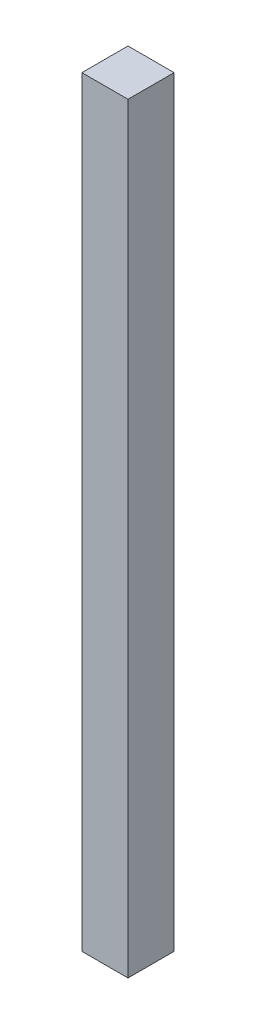
ISO-10303-21;
HEADER;
FILE_DESCRIPTION(('STEP AP214'),'2;1');
FILE_NAME('part.step','',(''),(''),'','','');
FILE_SCHEMA(('AUTOMOTIVE_DESIGN { 1 0 10303 214 1 1 1 1 }'));
ENDSEC;
DATA;
#1=APPLICATION_CONTEXT('core data for automotive mechanical design processes');
#2=APPLICATION_PROTOCOL_DEFINITION('international standard','automotive_design',2000,#1);
#3=PRODUCT_CONTEXT('',#1,'mechanical');
#4=PRODUCT('Part','Part','',(#3));
#5=PRODUCT_RELATED_PRODUCT_CATEGORY('part','',(#4));
#6=PRODUCT_DEFINITION_FORMATION('','',#4);
#7=PRODUCT_DEFINITION_CONTEXT('part definition',#1,'design');
#8=PRODUCT_DEFINITION('design','',#6,#7);
#9=PRODUCT_DEFINITION_SHAPE('','',#8);
#10=(LENGTH_UNIT() NAMED_UNIT(*) SI_UNIT(.MILLI.,.METRE.));
#11=(NAMED_UNIT(*) PLANE_ANGLE_UNIT() SI_UNIT($,.RADIAN.));
#12=(NAMED_UNIT(*) SI_UNIT($,.STERADIAN.) SOLID_ANGLE_UNIT());
#13=UNCERTAINTY_MEASURE_WITH_UNIT(LENGTH_MEASURE(1.E-05),#10,'distance_accuracy_value','');
#14=(GEOMETRIC_REPRESENTATION_CONTEXT(3) GLOBAL_UNCERTAINTY_ASSIGNED_CONTEXT((#13)) GLOBAL_UNIT_ASSIGNED_CONTEXT((#10,
#11,#12)) REPRESENTATION_CONTEXT('',''));
#15=CARTESIAN_POINT('',(0.,0.,0.));
#16=DIRECTION('',(0.,0.,1.));
#17=DIRECTION('',(1.,0.,0.));
#18=AXIS2_PLACEMENT_3D('',#15,#16,#17);
#19=CARTESIAN_POINT('',(10.,330.,-10.));
#20=DIRECTION('',(-1.,0.,0.));
#21=DIRECTION('',(0.,0.,1.));
#22=AXIS2_PLACEMENT_3D('',#19,#20,#21);
#23=PLANE('',#22);
#24=DIRECTION('',(0.,0.,-1.));
#25=VECTOR('',#24,1.);
#26=CARTESIAN_POINT('',(10.,0.,-10.));
#27=LINE('',#26,#25);
#28=CARTESIAN_POINT('',(10.,0.,9.99999999999999));
#29=VERTEX_POINT('',#28);
#30=CARTESIAN_POINT('',(10.,0.,-10.));
#31=VERTEX_POINT('',#30);
#32=EDGE_CURVE('E96',#29,#31,#27,.T.);
#33=ORIENTED_EDGE('',*,*,#32,.T.);
#34=DIRECTION('',(0.,-1.,0.));
#35=VECTOR('',#34,1.);
#36=CARTESIAN_POINT('',(10.,330.,-10.));
#37=LINE('',#36,#35);
#38=CARTESIAN_POINT('',(10.,330.,-10.));
#39=VERTEX_POINT('',#38);
#40=EDGE_CURVE('E11',#39,#31,#37,.T.);
#41=ORIENTED_EDGE('',*,*,#40,.F.);
#42=DIRECTION('',(0.,0.,-1.));
#43=VECTOR('',#42,1.);
#44=CARTESIAN_POINT('',(10.,330.,-10.));
#45=LINE('',#44,#43);
#46=CARTESIAN_POINT('',(10.,330.,9.99999999999999));
#47=VERTEX_POINT('',#46);
#48=EDGE_CURVE('E84',#47,#39,#45,.T.);
#49=ORIENTED_EDGE('',*,*,#48,.F.);
#50=DIRECTION('',(0.,-1.,0.));
#51=VECTOR('',#50,1.);
#52=CARTESIAN_POINT('',(10.,330.,9.99999999999999));
#53=LINE('',#52,#51);
#54=EDGE_CURVE('E92',#47,#29,#53,.T.);
#55=ORIENTED_EDGE('',*,*,#54,.T.);
#56=EDGE_LOOP('',(#33,#41,#49,#55));
#57=FACE_BOUND('',#56,.T.);
#58=ADVANCED_FACE('F33',(#57),#23,.F.);
#59=CARTESIAN_POINT('',(-10.,330.,-10.));
#60=DIRECTION('',(0.,0.,1.));
#61=DIRECTION('',(1.,0.,0.));
#62=AXIS2_PLACEMENT_3D('',#59,#60,#61);
#63=PLANE('',#62);
#64=DIRECTION('',(-1.,0.,0.));
#65=VECTOR('',#64,1.);
#66=CARTESIAN_POINT('',(-10.,0.,-10.));
#67=LINE('',#66,#65);
#68=CARTESIAN_POINT('',(-10.,0.,-10.));
#69=VERTEX_POINT('',#68);
#70=EDGE_CURVE('E88',#31,#69,#67,.T.);
#71=ORIENTED_EDGE('',*,*,#70,.T.);
#72=DIRECTION('',(0.,-1.,0.));
#73=VECTOR('',#72,1.);
#74=CARTESIAN_POINT('',(-10.,330.,-10.));
#75=LINE('',#74,#73);
#76=CARTESIAN_POINT('',(-10.,330.,-10.));
#77=VERTEX_POINT('',#76);
#78=EDGE_CURVE('E41',#77,#69,#75,.T.);
#79=ORIENTED_EDGE('',*,*,#78,.F.);
#80=DIRECTION('',(-1.,0.,0.));
#81=VECTOR('',#80,1.);
#82=CARTESIAN_POINT('',(-10.,330.,-10.));
#83=LINE('',#82,#81);
#84=EDGE_CURVE('E79',#39,#77,#83,.T.);
#85=ORIENTED_EDGE('',*,*,#84,.F.);
#86=ORIENTED_EDGE('',*,*,#40,.T.);
#87=EDGE_LOOP('',(#71,#79,#85,#86));
#88=FACE_BOUND('',#87,.T.);
#89=ADVANCED_FACE('F87',(#88),#63,.F.);
#90=CARTESIAN_POINT('',(-10.,330.,-10.));
#91=DIRECTION('',(1.,0.,0.));
#92=DIRECTION('',(0.,0.,-1.));
#93=AXIS2_PLACEMENT_3D('',#90,#91,#92);
#94=PLANE('',#93);
#95=DIRECTION('',(0.,0.,1.));
#96=VECTOR('',#95,1.);
#97=CARTESIAN_POINT('',(-10.,0.,-10.));
#98=LINE('',#97,#96);
#99=CARTESIAN_POINT('',(-10.,0.,9.99999999999999));
#100=VERTEX_POINT('',#99);
#101=EDGE_CURVE('E66',#69,#100,#98,.T.);
#102=ORIENTED_EDGE('',*,*,#101,.T.);
#103=DIRECTION('',(0.,-1.,0.));
#104=VECTOR('',#103,1.);
#105=CARTESIAN_POINT('',(-10.,330.,9.99999999999999));
#106=LINE('',#105,#104);
#107=CARTESIAN_POINT('',(-10.,330.,9.99999999999999));
#108=VERTEX_POINT('',#107);
#109=EDGE_CURVE('E89',#108,#100,#106,.T.);
#110=ORIENTED_EDGE('',*,*,#109,.F.);
#111=DIRECTION('',(0.,0.,1.));
#112=VECTOR('',#111,1.);
#113=CARTESIAN_POINT('',(-10.,330.,-10.));
#114=LINE('',#113,#112);
#115=EDGE_CURVE('E82',#77,#108,#114,.T.);
#116=ORIENTED_EDGE('',*,*,#115,.F.);
#117=ORIENTED_EDGE('',*,*,#78,.T.);
#118=EDGE_LOOP('',(#102,#110,#116,#117));
#119=FACE_BOUND('',#118,.T.);
#120=ADVANCED_FACE('F90',(#119),#94,.F.);
#121=CARTESIAN_POINT('',(-10.,330.,9.99999999999999));
#122=DIRECTION('',(0.,0.,-1.));
#123=DIRECTION('',(-1.,0.,0.));
#124=AXIS2_PLACEMENT_3D('',#121,#122,#123);
#125=PLANE('',#124);
#126=DIRECTION('',(1.,0.,0.));
#127=VECTOR('',#126,1.);
#128=CARTESIAN_POINT('',(-10.,0.,9.99999999999999));
#129=LINE('',#128,#127);
#130=EDGE_CURVE('E72',#100,#29,#129,.T.);
#131=ORIENTED_EDGE('',*,*,#130,.T.);
#132=ORIENTED_EDGE('',*,*,#54,.F.);
#133=DIRECTION('',(1.,0.,0.));
#134=VECTOR('',#133,1.);
#135=CARTESIAN_POINT('',(-10.,330.,9.99999999999999));
#136=LINE('',#135,#134);
#137=EDGE_CURVE('E49',#108,#47,#136,.T.);
#138=ORIENTED_EDGE('',*,*,#137,.F.);
#139=ORIENTED_EDGE('',*,*,#109,.T.);
#140=EDGE_LOOP('',(#131,#132,#138,#139));
#141=FACE_BOUND('',#140,.T.);
#142=ADVANCED_FACE('F103',(#141),#125,.F.);
#143=CARTESIAN_POINT('',(0.,330.,0.));
#144=DIRECTION('',(0.,1.,0.));
#145=DIRECTION('',(0.,0.,1.));
#146=AXIS2_PLACEMENT_3D('',#143,#144,#145);
#147=PLANE('',#146);
#148=ORIENTED_EDGE('',*,*,#48,.T.);
#149=ORIENTED_EDGE('',*,*,#84,.T.);
#150=ORIENTED_EDGE('',*,*,#115,.T.);
#151=ORIENTED_EDGE('',*,*,#137,.T.);
#152=EDGE_LOOP('',(#148,#149,#150,#151));
#153=FACE_BOUND('',#152,.T.);
#154=ADVANCED_FACE('F80',(#153),#147,.T.);
#155=CARTESIAN_POINT('',(0.,0.,0.));
#156=DIRECTION('',(0.,1.,0.));
#157=DIRECTION('',(0.,0.,1.));
#158=AXIS2_PLACEMENT_3D('',#155,#156,#157);
#159=PLANE('',#158);
#160=ORIENTED_EDGE('',*,*,#32,.F.);
#161=ORIENTED_EDGE('',*,*,#130,.F.);
#162=ORIENTED_EDGE('',*,*,#101,.F.);
#163=ORIENTED_EDGE('',*,*,#70,.F.);
#164=EDGE_LOOP('',(#160,#161,#162,#163));
#165=FACE_BOUND('',#164,.T.);
#166=ADVANCED_FACE('F106',(#165),#159,.F.);
#167=CLOSED_SHELL('',(#58,#89,#120,#142,#154,#166));
#168=MANIFOLD_SOLID_BREP('B2',#167);
#169=ADVANCED_BREP_SHAPE_REPRESENTATION('',(#18,#168),#14);
#170=SHAPE_DEFINITION_REPRESENTATION(#9,#169);
ENDSEC;
END-ISO-10303-21;
